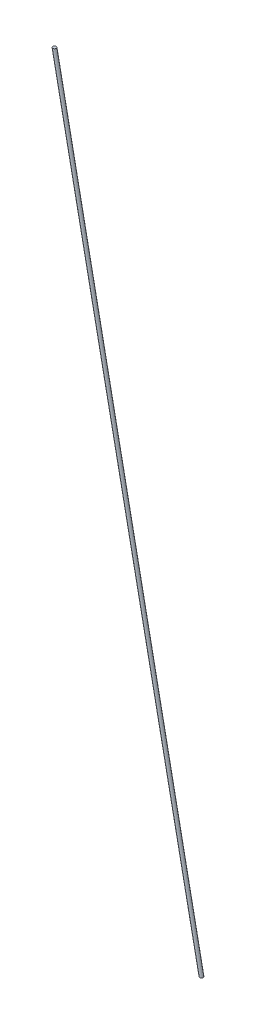
ISO-10303-21;
HEADER;
FILE_DESCRIPTION(('STEP AP214'),'2;1');
FILE_NAME('part.step','',(''),(''),'','','');
FILE_SCHEMA(('AUTOMOTIVE_DESIGN { 1 0 10303 214 1 1 1 1 }'));
ENDSEC;
DATA;
#1=APPLICATION_CONTEXT('core data for automotive mechanical design processes');
#2=APPLICATION_PROTOCOL_DEFINITION('international standard','automotive_design',2000,#1);
#3=PRODUCT_CONTEXT('',#1,'mechanical');
#4=PRODUCT('Part','Part','',(#3));
#5=PRODUCT_RELATED_PRODUCT_CATEGORY('part','',(#4));
#6=PRODUCT_DEFINITION_FORMATION('','',#4);
#7=PRODUCT_DEFINITION_CONTEXT('part definition',#1,'design');
#8=PRODUCT_DEFINITION('design','',#6,#7);
#9=PRODUCT_DEFINITION_SHAPE('','',#8);
#10=(LENGTH_UNIT() NAMED_UNIT(*) SI_UNIT(.MILLI.,.METRE.));
#11=(NAMED_UNIT(*) PLANE_ANGLE_UNIT() SI_UNIT($,.RADIAN.));
#12=(NAMED_UNIT(*) SI_UNIT($,.STERADIAN.) SOLID_ANGLE_UNIT());
#13=UNCERTAINTY_MEASURE_WITH_UNIT(LENGTH_MEASURE(1.E-05),#10,'distance_accuracy_value','');
#14=(GEOMETRIC_REPRESENTATION_CONTEXT(3) GLOBAL_UNCERTAINTY_ASSIGNED_CONTEXT((#13)) GLOBAL_UNIT_ASSIGNED_CONTEXT((#10,
#11,#12)) REPRESENTATION_CONTEXT('',''));
#15=CARTESIAN_POINT('',(0.,0.,0.));
#16=DIRECTION('',(0.,0.,1.));
#17=DIRECTION('',(1.,0.,0.));
#18=AXIS2_PLACEMENT_3D('',#15,#16,#17);
#19=CARTESIAN_POINT('',(0.,0.,0.));
#20=DIRECTION('',(0.,1.,0.));
#21=DIRECTION('',(0.,0.,1.));
#22=AXIS2_PLACEMENT_3D('',#19,#20,#21);
#23=PLANE('',#22);
#24=CARTESIAN_POINT('',(0.,0.,0.));
#25=DIRECTION('',(0.,1.,0.));
#26=DIRECTION('',(0.,0.,1.));
#27=AXIS2_PLACEMENT_3D('',#24,#25,#26);
#28=CIRCLE('',#27,2.);
#29=CARTESIAN_POINT('',(0.,0.,2.));
#30=VERTEX_POINT('',#29);
#31=EDGE_CURVE('E44',#30,#30,#28,.T.);
#32=ORIENTED_EDGE('',*,*,#31,.T.);
#33=EDGE_LOOP('',(#32));
#34=FACE_BOUND('',#33,.T.);
#35=ADVANCED_FACE('F37',(#34),#23,.T.);
#36=CARTESIAN_POINT('',(171.128500823723,-851.293245469522,0.));
#37=DIRECTION('',(0.,1.,0.));
#38=DIRECTION('',(0.,0.,1.));
#39=AXIS2_PLACEMENT_3D('',#36,#37,#38);
#40=PLANE('',#39);
#41=CARTESIAN_POINT('',(171.128500823723,-851.293245469522,0.));
#42=DIRECTION('',(0.,1.,0.));
#43=DIRECTION('',(0.,0.,1.));
#44=AXIS2_PLACEMENT_3D('',#41,#42,#43);
#45=CIRCLE('',#44,2.);
#46=CARTESIAN_POINT('',(171.128500823723,-851.293245469522,2.));
#47=VERTEX_POINT('',#46);
#48=EDGE_CURVE('E10',#47,#47,#45,.T.);
#49=ORIENTED_EDGE('',*,*,#48,.F.);
#50=EDGE_LOOP('',(#49));
#51=FACE_BOUND('',#50,.T.);
#52=ADVANCED_FACE('F54',(#51),#40,.F.);
#53=CARTESIAN_POINT('',(0.,0.,2.));
#54=CARTESIAN_POINT('',(171.128500823723,-851.293245469522,2.));
#55=CARTESIAN_POINT('',(4.,0.,2.));
#56=CARTESIAN_POINT('',(175.128500823723,-851.293245469522,2.));
#57=CARTESIAN_POINT('',(4.,0.,-2.));
#58=CARTESIAN_POINT('',(175.128500823723,-851.293245469522,-2.));
#59=CARTESIAN_POINT('',(0.,0.,-2.));
#60=CARTESIAN_POINT('',(171.128500823723,-851.293245469522,-2.));
#61=CARTESIAN_POINT('',(-4.,0.,-2.));
#62=CARTESIAN_POINT('',(167.128500823723,-851.293245469522,-2.));
#63=CARTESIAN_POINT('',(-4.,0.,2.));
#64=CARTESIAN_POINT('',(167.128500823723,-851.293245469522,2.));
#65=CARTESIAN_POINT('',(0.,0.,2.));
#66=CARTESIAN_POINT('',(171.128500823723,-851.293245469522,2.));
#67=(BOUNDED_SURFACE() B_SPLINE_SURFACE(3,1,((#53,#54),(#55,#56),(#57,#58),(#59,#60),(#61,#62),
(#63,#64),(#65,#66)),.UNSPECIFIED.,.T.,.F.,.F.) B_SPLINE_SURFACE_WITH_KNOTS((4,3,4),(2,2),(0.,
0.5,1.),(0.,1.),.UNSPECIFIED.) GEOMETRIC_REPRESENTATION_ITEM() RATIONAL_B_SPLINE_SURFACE(((1.,
1.),(0.333333333333333,0.333333333333333),(0.333333333333333,0.333333333333333),(1.,1.),
(0.333333333333333,0.333333333333333),(0.333333333333333,0.333333333333333),(1.,1.))) REPRESENTATION_ITEM('') SURFACE());
#68=CARTESIAN_POINT('',(171.128500823723,-851.293245469522,2.));
#69=CARTESIAN_POINT('',(169.345912273476,-842.425607495881,2.));
#70=CARTESIAN_POINT('',(167.563323723229,-833.55796952224,2.));
#71=CARTESIAN_POINT('',(163.998146622735,-815.822693574959,2.));
#72=CARTESIAN_POINT('',(162.215558072488,-806.955055601318,2.));
#73=CARTESIAN_POINT('',(158.650380971993,-789.219779654036,2.));
#74=CARTESIAN_POINT('',(156.867792421746,-780.352141680395,2.));
#75=CARTESIAN_POINT('',(153.302615321252,-762.616865733114,2.));
#76=CARTESIAN_POINT('',(151.520026771005,-753.749227759473,2.));
#77=CARTESIAN_POINT('',(147.954849670511,-736.013951812191,2.));
#78=CARTESIAN_POINT('',(146.172261120264,-727.14631383855,2.));
#79=CARTESIAN_POINT('',(142.607084019769,-709.411037891269,2.));
#80=CARTESIAN_POINT('',(140.824495469522,-700.543399917628,2.));
#81=CARTESIAN_POINT('',(137.259318369028,-682.808123970346,2.));
#82=CARTESIAN_POINT('',(135.476729818781,-673.940485996705,2.));
#83=CARTESIAN_POINT('',(131.911552718287,-656.205210049423,2.));
#84=CARTESIAN_POINT('',(130.12896416804,-647.337572075783,2.));
#85=CARTESIAN_POINT('',(126.563787067545,-629.602296128501,2.));
#86=CARTESIAN_POINT('',(124.781198517298,-620.73465815486,2.));
#87=CARTESIAN_POINT('',(121.216021416804,-602.999382207578,2.));
#88=CARTESIAN_POINT('',(119.433432866557,-594.131744233937,2.));
#89=CARTESIAN_POINT('',(115.868255766063,-576.396468286656,2.));
#90=CARTESIAN_POINT('',(114.085667215816,-567.528830313015,2.));
#91=CARTESIAN_POINT('',(110.520490115321,-549.793554365733,2.));
#92=CARTESIAN_POINT('',(108.737901565074,-540.925916392092,2.));
#93=CARTESIAN_POINT('',(105.17272446458,-523.190640444811,2.));
#94=CARTESIAN_POINT('',(103.390135914333,-514.32300247117,2.));
#95=CARTESIAN_POINT('',(99.8249588138386,-496.587726523888,2.));
#96=CARTESIAN_POINT('',(98.0423702635915,-487.720088550247,2.));
#97=CARTESIAN_POINT('',(94.4771931630973,-469.984812602965,2.));
#98=CARTESIAN_POINT('',(92.6946046128501,-461.117174629325,2.));
#99=CARTESIAN_POINT('',(89.1294275123559,-443.381898682043,2.));
#100=CARTESIAN_POINT('',(87.3468389621088,-434.514260708402,2.));
#101=CARTESIAN_POINT('',(83.7816618616146,-416.77898476112,2.));
#102=CARTESIAN_POINT('',(81.9990733113674,-407.911346787479,2.));
#103=CARTESIAN_POINT('',(78.4338962108732,-390.176070840198,2.));
#104=CARTESIAN_POINT('',(76.6513076606261,-381.308432866557,2.));
#105=CARTESIAN_POINT('',(73.0861305601318,-363.573156919275,2.));
#106=CARTESIAN_POINT('',(71.3035420098847,-354.705518945634,2.));
#107=CARTESIAN_POINT('',(67.7383649093905,-336.970242998353,2.));
#108=CARTESIAN_POINT('',(65.9557763591434,-328.102605024712,2.));
#109=CARTESIAN_POINT('',(62.3905992586491,-310.36732907743,2.));
#110=CARTESIAN_POINT('',(60.608010708402,-301.499691103789,2.));
#111=CARTESIAN_POINT('',(57.0428336079078,-283.764415156507,2.));
#112=CARTESIAN_POINT('',(55.2602450576607,-274.896777182867,2.));
#113=CARTESIAN_POINT('',(51.6950679571664,-257.161501235585,2.));
#114=CARTESIAN_POINT('',(49.9124794069193,-248.293863261944,2.));
#115=CARTESIAN_POINT('',(46.3473023064251,-230.558587314662,2.));
#116=CARTESIAN_POINT('',(44.564713756178,-221.690949341021,2.));
#117=CARTESIAN_POINT('',(40.9995366556837,-203.95567339374,2.));
#118=CARTESIAN_POINT('',(39.2169481054366,-195.088035420099,2.));
#119=CARTESIAN_POINT('',(35.6517710049424,-177.352759472817,2.));
#120=CARTESIAN_POINT('',(33.8691824546952,-168.485121499176,2.));
#121=CARTESIAN_POINT('',(30.304005354201,-150.749845551895,2.));
#122=CARTESIAN_POINT('',(28.5214168039539,-141.882207578254,2.));
#123=CARTESIAN_POINT('',(24.9562397034597,-124.146931630972,2.));
#124=CARTESIAN_POINT('',(23.1736511532125,-115.279293657331,2.));
#125=CARTESIAN_POINT('',(19.6084740527183,-97.5440177100494,2.));
#126=CARTESIAN_POINT('',(17.8258855024712,-88.6763797364086,2.));
#127=CARTESIAN_POINT('',(14.2607084019769,-70.9411037891269,2.));
#128=CARTESIAN_POINT('',(12.4781198517298,-62.073465815486,2.));
#129=CARTESIAN_POINT('',(8.91294275123559,-44.3381898682043,2.));
#130=CARTESIAN_POINT('',(7.13035420098847,-35.4705518945634,2.));
#131=CARTESIAN_POINT('',(3.56517710049424,-17.7352759472817,2.));
#132=CARTESIAN_POINT('',(1.78258855024712,-8.86763797364088,2.));
#133=CARTESIAN_POINT('',(0.,0.,2.));
#134=B_SPLINE_CURVE_WITH_KNOTS('',3,(#68,#69,#70,#71,#72,#73,#74,#75,#76,#77,#78,#79,#80,#81,
#82,#83,#84,#85,#86,#87,#88,#89,#90,#91,#92,#93,#94,#95,#96,#97,#98,#99,#100,#101,#102,#103,
#104,#105,#106,#107,#108,#109,#110,#111,#112,#113,#114,#115,#116,#117,#118,#119,#120,#121,#122,
#123,#124,#125,#126,#127,#128,#129,#130,#131,#132,#133),.UNSPECIFIED.,.F.,.F.,(4,2,2,2,2,2,2,2,
2,2,2,2,2,2,2,2,2,2,2,2,2,2,2,2,2,2,2,2,2,2,2,2,4),(0.,27.1350995306682,54.2701990613362,
81.4052985920044,108.540398122672,135.675497653341,162.810597184009,189.945696714677,
217.080796245345,244.215895776013,271.350995306681,298.486094837349,325.621194368017,
352.756293898685,379.891393429354,407.026492960022,434.16159249069,461.296692021358,
488.431791552026,515.566891082694,542.701990613362,569.83709014403,596.972189674698,
624.107289205367,651.242388736035,678.377488266703,705.512587797371,732.647687328039,
759.782786858707,786.917886389375,814.052985920043,841.188085450711,868.323184981379),.UNSPECIFIED.);
#135=EDGE_CURVE('BSEAM52',#47,#30,#134,.T.);
#136=ORIENTED_EDGE('',*,*,#48,.T.);
#137=ORIENTED_EDGE('',*,*,#31,.F.);
#138=ORIENTED_EDGE('',*,*,#135,.T.);
#139=ORIENTED_EDGE('',*,*,#135,.F.);
#140=EDGE_LOOP('',(#136,#138,#137,#139));
#141=FACE_BOUND('',#140,.T.);
#142=ADVANCED_FACE('F52',(#141),#67,.F.);
#143=CLOSED_SHELL('',(#35,#52,#142));
#144=MANIFOLD_SOLID_BREP('B2',#143);
#145=ADVANCED_BREP_SHAPE_REPRESENTATION('',(#18,#144),#14);
#146=SHAPE_DEFINITION_REPRESENTATION(#9,#145);
ENDSEC;
END-ISO-10303-21;
